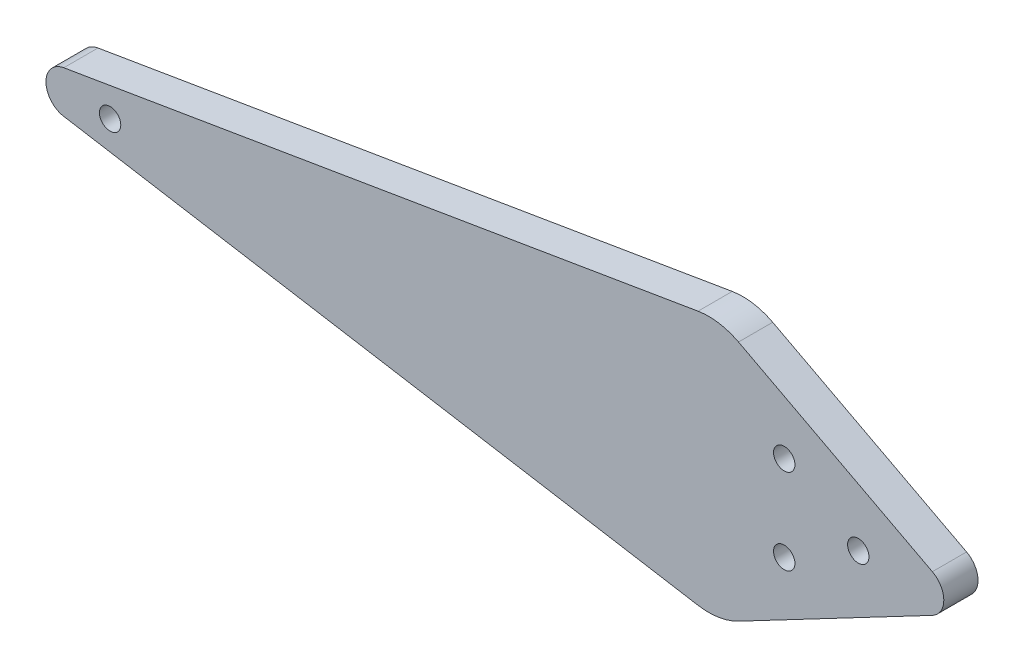
ISO-10303-21;
HEADER;
FILE_DESCRIPTION(('STEP AP214'),'2;1');
FILE_NAME('part.step','',(''),(''),'','','');
FILE_SCHEMA(('AUTOMOTIVE_DESIGN { 1 0 10303 214 1 1 1 1 }'));
ENDSEC;
DATA;
#1=APPLICATION_CONTEXT('core data for automotive mechanical design processes');
#2=APPLICATION_PROTOCOL_DEFINITION('international standard','automotive_design',2000,#1);
#3=PRODUCT_CONTEXT('',#1,'mechanical');
#4=PRODUCT('Part','Part','',(#3));
#5=PRODUCT_RELATED_PRODUCT_CATEGORY('part','',(#4));
#6=PRODUCT_DEFINITION_FORMATION('','',#4);
#7=PRODUCT_DEFINITION_CONTEXT('part definition',#1,'design');
#8=PRODUCT_DEFINITION('design','',#6,#7);
#9=PRODUCT_DEFINITION_SHAPE('','',#8);
#10=(LENGTH_UNIT() NAMED_UNIT(*) SI_UNIT(.MILLI.,.METRE.));
#11=(NAMED_UNIT(*) PLANE_ANGLE_UNIT() SI_UNIT($,.RADIAN.));
#12=(NAMED_UNIT(*) SI_UNIT($,.STERADIAN.) SOLID_ANGLE_UNIT());
#13=UNCERTAINTY_MEASURE_WITH_UNIT(LENGTH_MEASURE(1.E-05),#10,'distance_accuracy_value','');
#14=(GEOMETRIC_REPRESENTATION_CONTEXT(3) GLOBAL_UNCERTAINTY_ASSIGNED_CONTEXT((#13)) GLOBAL_UNIT_ASSIGNED_CONTEXT((#10,
#11,#12)) REPRESENTATION_CONTEXT('',''));
#15=CARTESIAN_POINT('',(0.,0.,0.));
#16=DIRECTION('',(0.,0.,1.));
#17=DIRECTION('',(1.,0.,0.));
#18=AXIS2_PLACEMENT_3D('',#15,#16,#17);
#19=CARTESIAN_POINT('',(100.,0.,8.));
#20=DIRECTION('',(0.,0.,1.));
#21=DIRECTION('',(1.,0.,0.));
#22=AXIS2_PLACEMENT_3D('',#19,#20,#21);
#23=PLANE('',#22);
#24=CARTESIAN_POINT('',(67.6794919243113,-10.,8.));
#25=DIRECTION('',(0.,0.,1.));
#26=DIRECTION('',(-1.,0.,0.));
#27=AXIS2_PLACEMENT_3D('',#24,#25,#26);
#28=CIRCLE('',#27,2.5);
#29=CARTESIAN_POINT('',(65.1794919243113,-10.,8.));
#30=VERTEX_POINT('',#29);
#31=EDGE_CURVE('E190',#30,#30,#28,.T.);
#32=ORIENTED_EDGE('',*,*,#31,.F.);
#33=EDGE_LOOP('',(#32));
#34=FACE_BOUND('',#33,.T.);
#35=CARTESIAN_POINT('',(85.,0.,8.));
#36=DIRECTION('',(0.,0.,1.));
#37=DIRECTION('',(1.,0.,0.));
#38=AXIS2_PLACEMENT_3D('',#35,#36,#37);
#39=CIRCLE('',#38,2.5);
#40=CARTESIAN_POINT('',(87.5,0.,8.));
#41=VERTEX_POINT('',#40);
#42=EDGE_CURVE('E136',#41,#41,#39,.T.);
#43=ORIENTED_EDGE('',*,*,#42,.F.);
#44=EDGE_LOOP('',(#43));
#45=FACE_BOUND('',#44,.T.);
#46=CARTESIAN_POINT('',(100.,0.,8.));
#47=DIRECTION('',(0.,0.,1.));
#48=DIRECTION('',(1.,0.,0.));
#49=AXIS2_PLACEMENT_3D('',#46,#47,#48);
#50=CIRCLE('',#49,5.);
#51=CARTESIAN_POINT('',(102.327562032013,-4.42520677337596,8.));
#52=VERTEX_POINT('',#51);
#53=CARTESIAN_POINT('',(102.327562032013,4.42520677337596,8.));
#54=VERTEX_POINT('',#53);
#55=EDGE_CURVE('E147',#52,#54,#50,.T.);
#56=ORIENTED_EDGE('',*,*,#55,.T.);
#57=DIRECTION('',(-0.885041354675192,0.465512406402558,0.));
#58=VECTOR('',#57,1.);
#59=CARTESIAN_POINT('',(56.9826860960384,28.2756203201279,8.));
#60=LINE('',#59,#58);
#61=CARTESIAN_POINT('',(56.9826860960384,28.2756203201279,8.));
#62=VERTEX_POINT('',#61);
#63=EDGE_CURVE('E95',#54,#62,#60,.T.);
#64=ORIENTED_EDGE('',*,*,#63,.T.);
#65=CARTESIAN_POINT('',(50.,15.,8.));
#66=DIRECTION('',(0.,0.,1.));
#67=DIRECTION('',(1.,0.,0.));
#68=AXIS2_PLACEMENT_3D('',#65,#66,#67);
#69=CIRCLE('',#68,15.);
#70=CARTESIAN_POINT('',(47.520632776585,29.7936722341498,8.));
#71=VERTEX_POINT('',#70);
#72=EDGE_CURVE('E162',#62,#71,#69,.T.);
#73=ORIENTED_EDGE('',*,*,#72,.T.);
#74=DIRECTION('',(-0.986244815609988,-0.165291148227665,0.));
#75=VECTOR('',#74,1.);
#76=CARTESIAN_POINT('',(-100.826455741138,4.93122407804994,8.));
#77=LINE('',#76,#75);
#78=CARTESIAN_POINT('',(-100.826455741138,4.93122407804994,8.));
#79=VERTEX_POINT('',#78);
#80=EDGE_CURVE('E175',#71,#79,#77,.T.);
#81=ORIENTED_EDGE('',*,*,#80,.T.);
#82=CARTESIAN_POINT('',(-100.,0.,8.));
#83=DIRECTION('',(0.,0.,1.));
#84=DIRECTION('',(1.,0.,0.));
#85=AXIS2_PLACEMENT_3D('',#82,#83,#84);
#86=CIRCLE('',#85,5.);
#87=CARTESIAN_POINT('',(-100.826455741138,-4.93122407804994,8.));
#88=VERTEX_POINT('',#87);
#89=EDGE_CURVE('E114',#79,#88,#86,.T.);
#90=ORIENTED_EDGE('',*,*,#89,.T.);
#91=DIRECTION('',(0.986244815609988,-0.165291148227665,0.));
#92=VECTOR('',#91,1.);
#93=CARTESIAN_POINT('',(-100.826455741138,-4.93122407804994,8.));
#94=LINE('',#93,#92);
#95=CARTESIAN_POINT('',(47.520632776585,-29.7936722341498,8.));
#96=VERTEX_POINT('',#95);
#97=EDGE_CURVE('E108',#88,#96,#94,.T.);
#98=ORIENTED_EDGE('',*,*,#97,.T.);
#99=CARTESIAN_POINT('',(50.,-15.,8.));
#100=DIRECTION('',(0.,0.,1.));
#101=DIRECTION('',(-1.,0.,0.));
#102=AXIS2_PLACEMENT_3D('',#99,#100,#101);
#103=CIRCLE('',#102,15.);
#104=CARTESIAN_POINT('',(56.9826860960384,-28.2756203201279,8.));
#105=VERTEX_POINT('',#104);
#106=EDGE_CURVE('E112',#96,#105,#103,.T.);
#107=ORIENTED_EDGE('',*,*,#106,.T.);
#108=DIRECTION('',(0.885041354675192,0.465512406402558,0.));
#109=VECTOR('',#108,1.);
#110=CARTESIAN_POINT('',(56.9826860960384,-28.2756203201279,8.));
#111=LINE('',#110,#109);
#112=EDGE_CURVE('E52',#105,#52,#111,.T.);
#113=ORIENTED_EDGE('',*,*,#112,.T.);
#114=EDGE_LOOP('',(#56,#64,#73,#81,#90,#98,#107,#113));
#115=FACE_BOUND('',#114,.T.);
#116=CARTESIAN_POINT('',(67.6794919243113,10.,8.));
#117=DIRECTION('',(0.,0.,1.));
#118=DIRECTION('',(1.,0.,0.));
#119=AXIS2_PLACEMENT_3D('',#116,#117,#118);
#120=CIRCLE('',#119,2.5);
#121=CARTESIAN_POINT('',(70.1794919243113,10.,8.));
#122=VERTEX_POINT('',#121);
#123=EDGE_CURVE('E184',#122,#122,#120,.T.);
#124=ORIENTED_EDGE('',*,*,#123,.F.);
#125=EDGE_LOOP('',(#124));
#126=FACE_BOUND('',#125,.T.);
#127=CARTESIAN_POINT('',(-90.,0.,8.));
#128=DIRECTION('',(0.,0.,1.));
#129=DIRECTION('',(1.,0.,0.));
#130=AXIS2_PLACEMENT_3D('',#127,#128,#129);
#131=CIRCLE('',#130,2.5);
#132=CARTESIAN_POINT('',(-87.5,0.,8.));
#133=VERTEX_POINT('',#132);
#134=EDGE_CURVE('E196',#133,#133,#131,.T.);
#135=ORIENTED_EDGE('',*,*,#134,.F.);
#136=EDGE_LOOP('',(#135));
#137=FACE_BOUND('',#136,.T.);
#138=ADVANCED_FACE('F35',(#34,#45,#115,#126,#137),#23,.T.);
#139=CARTESIAN_POINT('',(100.,0.,0.));
#140=DIRECTION('',(0.,0.,1.));
#141=DIRECTION('',(1.,0.,0.));
#142=AXIS2_PLACEMENT_3D('',#139,#140,#141);
#143=PLANE('',#142);
#144=CARTESIAN_POINT('',(100.,0.,0.));
#145=DIRECTION('',(0.,0.,1.));
#146=DIRECTION('',(1.,0.,0.));
#147=AXIS2_PLACEMENT_3D('',#144,#145,#146);
#148=CIRCLE('',#147,5.);
#149=CARTESIAN_POINT('',(102.327562032013,-4.42520677337596,0.));
#150=VERTEX_POINT('',#149);
#151=CARTESIAN_POINT('',(102.327562032013,4.42520677337596,0.));
#152=VERTEX_POINT('',#151);
#153=EDGE_CURVE('E132',#150,#152,#148,.T.);
#154=ORIENTED_EDGE('',*,*,#153,.F.);
#155=DIRECTION('',(0.885041354675192,0.465512406402558,0.));
#156=VECTOR('',#155,1.);
#157=CARTESIAN_POINT('',(56.9826860960384,-28.2756203201279,0.));
#158=LINE('',#157,#156);
#159=CARTESIAN_POINT('',(56.9826860960384,-28.2756203201279,0.));
#160=VERTEX_POINT('',#159);
#161=EDGE_CURVE('E87',#160,#150,#158,.T.);
#162=ORIENTED_EDGE('',*,*,#161,.F.);
#163=CARTESIAN_POINT('',(50.,-15.,0.));
#164=DIRECTION('',(0.,0.,1.));
#165=DIRECTION('',(-1.,0.,0.));
#166=AXIS2_PLACEMENT_3D('',#163,#164,#165);
#167=CIRCLE('',#166,15.);
#168=CARTESIAN_POINT('',(47.520632776585,-29.7936722341498,0.));
#169=VERTEX_POINT('',#168);
#170=EDGE_CURVE('E81',#169,#160,#167,.T.);
#171=ORIENTED_EDGE('',*,*,#170,.F.);
#172=DIRECTION('',(0.986244815609988,-0.165291148227665,0.));
#173=VECTOR('',#172,1.);
#174=CARTESIAN_POINT('',(-100.826455741138,-4.93122407804994,0.));
#175=LINE('',#174,#173);
#176=CARTESIAN_POINT('',(-100.826455741138,-4.93122407804994,0.));
#177=VERTEX_POINT('',#176);
#178=EDGE_CURVE('E122',#177,#169,#175,.T.);
#179=ORIENTED_EDGE('',*,*,#178,.F.);
#180=CARTESIAN_POINT('',(-100.,0.,0.));
#181=DIRECTION('',(0.,0.,1.));
#182=DIRECTION('',(1.,0.,0.));
#183=AXIS2_PLACEMENT_3D('',#180,#181,#182);
#184=CIRCLE('',#183,5.);
#185=CARTESIAN_POINT('',(-100.826455741138,4.93122407804994,0.));
#186=VERTEX_POINT('',#185);
#187=EDGE_CURVE('E142',#186,#177,#184,.T.);
#188=ORIENTED_EDGE('',*,*,#187,.F.);
#189=DIRECTION('',(-0.986244815609988,-0.165291148227665,0.));
#190=VECTOR('',#189,1.);
#191=CARTESIAN_POINT('',(-100.826455741138,4.93122407804994,0.));
#192=LINE('',#191,#190);
#193=CARTESIAN_POINT('',(47.520632776585,29.7936722341498,0.));
#194=VERTEX_POINT('',#193);
#195=EDGE_CURVE('E140',#194,#186,#192,.T.);
#196=ORIENTED_EDGE('',*,*,#195,.F.);
#197=CARTESIAN_POINT('',(50.,15.,0.));
#198=DIRECTION('',(0.,0.,1.));
#199=DIRECTION('',(1.,0.,0.));
#200=AXIS2_PLACEMENT_3D('',#197,#198,#199);
#201=CIRCLE('',#200,15.);
#202=CARTESIAN_POINT('',(56.9826860960384,28.2756203201279,0.));
#203=VERTEX_POINT('',#202);
#204=EDGE_CURVE('E138',#203,#194,#201,.T.);
#205=ORIENTED_EDGE('',*,*,#204,.F.);
#206=DIRECTION('',(-0.885041354675192,0.465512406402558,0.));
#207=VECTOR('',#206,1.);
#208=CARTESIAN_POINT('',(56.9826860960384,28.2756203201279,0.));
#209=LINE('',#208,#207);
#210=EDGE_CURVE('E135',#152,#203,#209,.T.);
#211=ORIENTED_EDGE('',*,*,#210,.F.);
#212=EDGE_LOOP('',(#154,#162,#171,#179,#188,#196,#205,#211));
#213=FACE_BOUND('',#212,.T.);
#214=CARTESIAN_POINT('',(85.,0.,0.));
#215=DIRECTION('',(0.,0.,1.));
#216=DIRECTION('',(1.,0.,0.));
#217=AXIS2_PLACEMENT_3D('',#214,#215,#216);
#218=CIRCLE('',#217,2.5);
#219=CARTESIAN_POINT('',(87.5,0.,0.));
#220=VERTEX_POINT('',#219);
#221=EDGE_CURVE('E181',#220,#220,#218,.T.);
#222=ORIENTED_EDGE('',*,*,#221,.T.);
#223=EDGE_LOOP('',(#222));
#224=FACE_BOUND('',#223,.T.);
#225=CARTESIAN_POINT('',(67.6794919243113,10.,0.));
#226=DIRECTION('',(0.,0.,1.));
#227=DIRECTION('',(1.,0.,0.));
#228=AXIS2_PLACEMENT_3D('',#225,#226,#227);
#229=CIRCLE('',#228,2.5);
#230=CARTESIAN_POINT('',(70.1794919243113,10.,0.));
#231=VERTEX_POINT('',#230);
#232=EDGE_CURVE('E187',#231,#231,#229,.T.);
#233=ORIENTED_EDGE('',*,*,#232,.T.);
#234=EDGE_LOOP('',(#233));
#235=FACE_BOUND('',#234,.T.);
#236=CARTESIAN_POINT('',(67.6794919243113,-10.,0.));
#237=DIRECTION('',(0.,0.,1.));
#238=DIRECTION('',(-1.,0.,0.));
#239=AXIS2_PLACEMENT_3D('',#236,#237,#238);
#240=CIRCLE('',#239,2.5);
#241=CARTESIAN_POINT('',(65.1794919243113,-10.,0.));
#242=VERTEX_POINT('',#241);
#243=EDGE_CURVE('E193',#242,#242,#240,.T.);
#244=ORIENTED_EDGE('',*,*,#243,.T.);
#245=EDGE_LOOP('',(#244));
#246=FACE_BOUND('',#245,.T.);
#247=CARTESIAN_POINT('',(-90.,0.,0.));
#248=DIRECTION('',(0.,0.,1.));
#249=DIRECTION('',(1.,0.,0.));
#250=AXIS2_PLACEMENT_3D('',#247,#248,#249);
#251=CIRCLE('',#250,2.5);
#252=CARTESIAN_POINT('',(-87.5,0.,0.));
#253=VERTEX_POINT('',#252);
#254=EDGE_CURVE('E199',#253,#253,#251,.T.);
#255=ORIENTED_EDGE('',*,*,#254,.T.);
#256=EDGE_LOOP('',(#255));
#257=FACE_BOUND('',#256,.T.);
#258=ADVANCED_FACE('F166',(#213,#224,#235,#246,#257),#143,.F.);
#259=CARTESIAN_POINT('',(100.,0.,8.));
#260=DIRECTION('',(0.,0.,-1.));
#261=DIRECTION('',(-1.,0.,0.));
#262=AXIS2_PLACEMENT_3D('',#259,#260,#261);
#263=CYLINDRICAL_SURFACE('',#262,5.);
#264=ORIENTED_EDGE('',*,*,#153,.T.);
#265=DIRECTION('',(0.,0.,-1.));
#266=VECTOR('',#265,1.);
#267=CARTESIAN_POINT('',(102.327562032013,4.42520677337596,8.));
#268=LINE('',#267,#266);
#269=EDGE_CURVE('E11',#54,#152,#268,.T.);
#270=ORIENTED_EDGE('',*,*,#269,.F.);
#271=ORIENTED_EDGE('',*,*,#55,.F.);
#272=DIRECTION('',(0.,0.,-1.));
#273=VECTOR('',#272,1.);
#274=CARTESIAN_POINT('',(102.327562032013,-4.42520677337596,8.));
#275=LINE('',#274,#273);
#276=EDGE_CURVE('E128',#52,#150,#275,.T.);
#277=ORIENTED_EDGE('',*,*,#276,.T.);
#278=EDGE_LOOP('',(#264,#270,#271,#277));
#279=FACE_BOUND('',#278,.T.);
#280=ADVANCED_FACE('F37',(#279),#263,.T.);
#281=CARTESIAN_POINT('',(56.9826860960384,28.2756203201279,8.));
#282=DIRECTION('',(-0.465512406402558,-0.885041354675192,0.));
#283=DIRECTION('',(0.885041354675192,-0.465512406402558,0.));
#284=AXIS2_PLACEMENT_3D('',#281,#282,#283);
#285=PLANE('',#284);
#286=ORIENTED_EDGE('',*,*,#210,.T.);
#287=DIRECTION('',(0.,0.,-1.));
#288=VECTOR('',#287,1.);
#289=CARTESIAN_POINT('',(56.9826860960384,28.2756203201279,8.));
#290=LINE('',#289,#288);
#291=EDGE_CURVE('E44',#62,#203,#290,.T.);
#292=ORIENTED_EDGE('',*,*,#291,.F.);
#293=ORIENTED_EDGE('',*,*,#63,.F.);
#294=ORIENTED_EDGE('',*,*,#269,.T.);
#295=EDGE_LOOP('',(#286,#292,#293,#294));
#296=FACE_BOUND('',#295,.T.);
#297=ADVANCED_FACE('F233',(#296),#285,.F.);
#298=CARTESIAN_POINT('',(50.,15.,8.));
#299=DIRECTION('',(0.,0.,-1.));
#300=DIRECTION('',(-1.,0.,0.));
#301=AXIS2_PLACEMENT_3D('',#298,#299,#300);
#302=CYLINDRICAL_SURFACE('',#301,15.);
#303=ORIENTED_EDGE('',*,*,#204,.T.);
#304=DIRECTION('',(0.,0.,-1.));
#305=VECTOR('',#304,1.);
#306=CARTESIAN_POINT('',(47.520632776585,29.7936722341498,8.));
#307=LINE('',#306,#305);
#308=EDGE_CURVE('E154',#71,#194,#307,.T.);
#309=ORIENTED_EDGE('',*,*,#308,.F.);
#310=ORIENTED_EDGE('',*,*,#72,.F.);
#311=ORIENTED_EDGE('',*,*,#291,.T.);
#312=EDGE_LOOP('',(#303,#309,#310,#311));
#313=FACE_BOUND('',#312,.T.);
#314=ADVANCED_FACE('F160',(#313),#302,.T.);
#315=CARTESIAN_POINT('',(-100.826455741138,4.93122407804994,8.));
#316=DIRECTION('',(0.165291148227665,-0.986244815609988,0.));
#317=DIRECTION('',(0.986244815609988,0.165291148227665,0.));
#318=AXIS2_PLACEMENT_3D('',#315,#316,#317);
#319=PLANE('',#318);
#320=ORIENTED_EDGE('',*,*,#195,.T.);
#321=DIRECTION('',(0.,0.,-1.));
#322=VECTOR('',#321,1.);
#323=CARTESIAN_POINT('',(-100.826455741138,4.93122407804994,8.));
#324=LINE('',#323,#322);
#325=EDGE_CURVE('E151',#79,#186,#324,.T.);
#326=ORIENTED_EDGE('',*,*,#325,.F.);
#327=ORIENTED_EDGE('',*,*,#80,.F.);
#328=ORIENTED_EDGE('',*,*,#308,.T.);
#329=EDGE_LOOP('',(#320,#326,#327,#328));
#330=FACE_BOUND('',#329,.T.);
#331=ADVANCED_FACE('F171',(#330),#319,.F.);
#332=CARTESIAN_POINT('',(-100.,0.,8.));
#333=DIRECTION('',(0.,0.,-1.));
#334=DIRECTION('',(-1.,0.,0.));
#335=AXIS2_PLACEMENT_3D('',#332,#333,#334);
#336=CYLINDRICAL_SURFACE('',#335,5.);
#337=ORIENTED_EDGE('',*,*,#187,.T.);
#338=DIRECTION('',(0.,0.,-1.));
#339=VECTOR('',#338,1.);
#340=CARTESIAN_POINT('',(-100.826455741138,-4.93122407804994,8.));
#341=LINE('',#340,#339);
#342=EDGE_CURVE('E123',#88,#177,#341,.T.);
#343=ORIENTED_EDGE('',*,*,#342,.F.);
#344=ORIENTED_EDGE('',*,*,#89,.F.);
#345=ORIENTED_EDGE('',*,*,#325,.T.);
#346=EDGE_LOOP('',(#337,#343,#344,#345));
#347=FACE_BOUND('',#346,.T.);
#348=ADVANCED_FACE('F174',(#347),#336,.T.);
#349=CARTESIAN_POINT('',(-100.826455741138,-4.93122407804994,8.));
#350=DIRECTION('',(0.165291148227665,0.986244815609988,0.));
#351=DIRECTION('',(-0.986244815609988,0.165291148227665,0.));
#352=AXIS2_PLACEMENT_3D('',#349,#350,#351);
#353=PLANE('',#352);
#354=ORIENTED_EDGE('',*,*,#178,.T.);
#355=DIRECTION('',(0.,0.,-1.));
#356=VECTOR('',#355,1.);
#357=CARTESIAN_POINT('',(47.520632776585,-29.7936722341498,8.));
#358=LINE('',#357,#356);
#359=EDGE_CURVE('E119',#96,#169,#358,.T.);
#360=ORIENTED_EDGE('',*,*,#359,.F.);
#361=ORIENTED_EDGE('',*,*,#97,.F.);
#362=ORIENTED_EDGE('',*,*,#342,.T.);
#363=EDGE_LOOP('',(#354,#360,#361,#362));
#364=FACE_BOUND('',#363,.T.);
#365=ADVANCED_FACE('F120',(#364),#353,.F.);
#366=CARTESIAN_POINT('',(50.,-15.,8.));
#367=DIRECTION('',(0.,0.,-1.));
#368=DIRECTION('',(-1.,0.,0.));
#369=AXIS2_PLACEMENT_3D('',#366,#367,#368);
#370=CYLINDRICAL_SURFACE('',#369,15.);
#371=ORIENTED_EDGE('',*,*,#170,.T.);
#372=DIRECTION('',(0.,0.,-1.));
#373=VECTOR('',#372,1.);
#374=CARTESIAN_POINT('',(56.9826860960384,-28.2756203201279,8.));
#375=LINE('',#374,#373);
#376=EDGE_CURVE('E124',#105,#160,#375,.T.);
#377=ORIENTED_EDGE('',*,*,#376,.F.);
#378=ORIENTED_EDGE('',*,*,#106,.F.);
#379=ORIENTED_EDGE('',*,*,#359,.T.);
#380=EDGE_LOOP('',(#371,#377,#378,#379));
#381=FACE_BOUND('',#380,.T.);
#382=ADVANCED_FACE('F126',(#381),#370,.T.);
#383=CARTESIAN_POINT('',(56.9826860960384,-28.2756203201279,8.));
#384=DIRECTION('',(-0.465512406402558,0.885041354675192,0.));
#385=DIRECTION('',(-0.885041354675192,-0.465512406402558,0.));
#386=AXIS2_PLACEMENT_3D('',#383,#384,#385);
#387=PLANE('',#386);
#388=ORIENTED_EDGE('',*,*,#161,.T.);
#389=ORIENTED_EDGE('',*,*,#276,.F.);
#390=ORIENTED_EDGE('',*,*,#112,.F.);
#391=ORIENTED_EDGE('',*,*,#376,.T.);
#392=EDGE_LOOP('',(#388,#389,#390,#391));
#393=FACE_BOUND('',#392,.T.);
#394=ADVANCED_FACE('F221',(#393),#387,.F.);
#395=CARTESIAN_POINT('',(85.,0.,8.));
#396=DIRECTION('',(0.,0.,-1.));
#397=DIRECTION('',(-1.,0.,0.));
#398=AXIS2_PLACEMENT_3D('',#395,#396,#397);
#399=CYLINDRICAL_SURFACE('',#398,2.5);
#400=ORIENTED_EDGE('',*,*,#42,.T.);
#401=EDGE_LOOP('',(#400));
#402=FACE_BOUND('',#401,.T.);
#403=ORIENTED_EDGE('',*,*,#221,.F.);
#404=EDGE_LOOP('',(#403));
#405=FACE_BOUND('',#404,.T.);
#406=ADVANCED_FACE('F218',(#402,#405),#399,.F.);
#407=CARTESIAN_POINT('',(67.6794919243113,10.,8.));
#408=DIRECTION('',(0.,0.,-1.));
#409=DIRECTION('',(-1.,0.,0.));
#410=AXIS2_PLACEMENT_3D('',#407,#408,#409);
#411=CYLINDRICAL_SURFACE('',#410,2.5);
#412=ORIENTED_EDGE('',*,*,#123,.T.);
#413=EDGE_LOOP('',(#412));
#414=FACE_BOUND('',#413,.T.);
#415=ORIENTED_EDGE('',*,*,#232,.F.);
#416=EDGE_LOOP('',(#415));
#417=FACE_BOUND('',#416,.T.);
#418=ADVANCED_FACE('F297',(#414,#417),#411,.F.);
#419=CARTESIAN_POINT('',(67.6794919243113,-10.,8.));
#420=DIRECTION('',(0.,0.,-1.));
#421=DIRECTION('',(-1.,0.,0.));
#422=AXIS2_PLACEMENT_3D('',#419,#420,#421);
#423=CYLINDRICAL_SURFACE('',#422,2.5);
#424=ORIENTED_EDGE('',*,*,#31,.T.);
#425=EDGE_LOOP('',(#424));
#426=FACE_BOUND('',#425,.T.);
#427=ORIENTED_EDGE('',*,*,#243,.F.);
#428=EDGE_LOOP('',(#427));
#429=FACE_BOUND('',#428,.T.);
#430=ADVANCED_FACE('F305',(#426,#429),#423,.F.);
#431=CARTESIAN_POINT('',(-90.,0.,8.));
#432=DIRECTION('',(0.,0.,-1.));
#433=DIRECTION('',(-1.,0.,0.));
#434=AXIS2_PLACEMENT_3D('',#431,#432,#433);
#435=CYLINDRICAL_SURFACE('',#434,2.5);
#436=ORIENTED_EDGE('',*,*,#134,.T.);
#437=EDGE_LOOP('',(#436));
#438=FACE_BOUND('',#437,.T.);
#439=ORIENTED_EDGE('',*,*,#254,.F.);
#440=EDGE_LOOP('',(#439));
#441=FACE_BOUND('',#440,.T.);
#442=ADVANCED_FACE('F205',(#438,#441),#435,.F.);
#443=CLOSED_SHELL('',(#138,#258,#280,#297,#314,#331,#348,#365,#382,#394,#406,#418,#430,#442));
#444=MANIFOLD_SOLID_BREP('B2',#443);
#445=ADVANCED_BREP_SHAPE_REPRESENTATION('',(#18,#444),#14);
#446=SHAPE_DEFINITION_REPRESENTATION(#9,#445);
ENDSEC;
END-ISO-10303-21;
